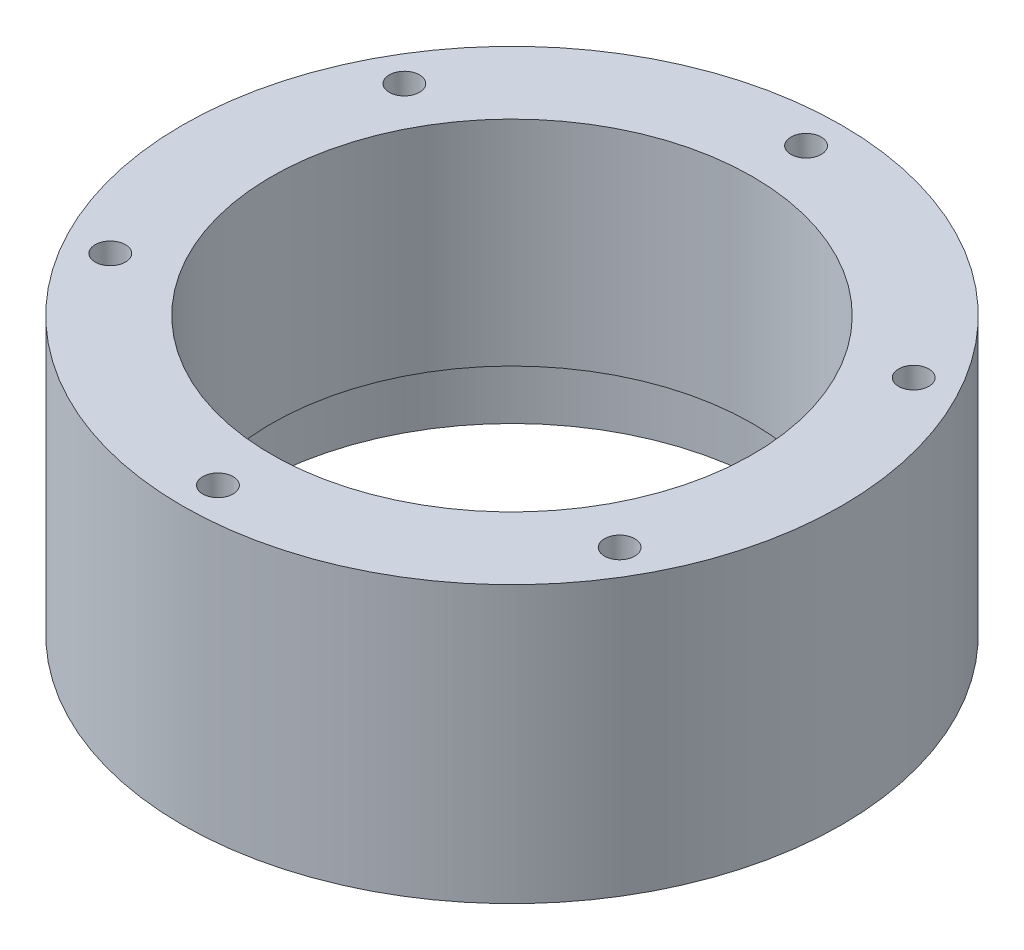
ISO-10303-21;
HEADER;
FILE_DESCRIPTION(('STEP AP214'),'2;1');
FILE_NAME('part.step','',(''),(''),'','','');
FILE_SCHEMA(('AUTOMOTIVE_DESIGN { 1 0 10303 214 1 1 1 1 }'));
ENDSEC;
DATA;
#1=APPLICATION_CONTEXT('core data for automotive mechanical design processes');
#2=APPLICATION_PROTOCOL_DEFINITION('international standard','automotive_design',2000,#1);
#3=PRODUCT_CONTEXT('',#1,'mechanical');
#4=PRODUCT('Part','Part','',(#3));
#5=PRODUCT_RELATED_PRODUCT_CATEGORY('part','',(#4));
#6=PRODUCT_DEFINITION_FORMATION('','',#4);
#7=PRODUCT_DEFINITION_CONTEXT('part definition',#1,'design');
#8=PRODUCT_DEFINITION('design','',#6,#7);
#9=PRODUCT_DEFINITION_SHAPE('','',#8);
#10=(LENGTH_UNIT() NAMED_UNIT(*) SI_UNIT(.MILLI.,.METRE.));
#11=(NAMED_UNIT(*) PLANE_ANGLE_UNIT() SI_UNIT($,.RADIAN.));
#12=(NAMED_UNIT(*) SI_UNIT($,.STERADIAN.) SOLID_ANGLE_UNIT());
#13=UNCERTAINTY_MEASURE_WITH_UNIT(LENGTH_MEASURE(1.E-05),#10,'distance_accuracy_value','');
#14=(GEOMETRIC_REPRESENTATION_CONTEXT(3) GLOBAL_UNCERTAINTY_ASSIGNED_CONTEXT((#13)) GLOBAL_UNIT_ASSIGNED_CONTEXT((#10,
#11,#12)) REPRESENTATION_CONTEXT('',''));
#15=CARTESIAN_POINT('',(0.,0.,0.));
#16=DIRECTION('',(0.,0.,1.));
#17=DIRECTION('',(1.,0.,0.));
#18=AXIS2_PLACEMENT_3D('',#15,#16,#17);
#19=CARTESIAN_POINT('',(0.,0.,0.));
#20=DIRECTION('',(0.,-1.,0.));
#21=DIRECTION('',(0.,0.,-1.));
#22=AXIS2_PLACEMENT_3D('',#19,#20,#21);
#23=CYLINDRICAL_SURFACE('',#22,29.);
#24=CARTESIAN_POINT('',(0.,0.,0.));
#25=DIRECTION('',(0.,-1.,0.));
#26=DIRECTION('',(0.,0.,-1.));
#27=AXIS2_PLACEMENT_3D('',#24,#25,#26);
#28=CIRCLE('',#27,29.);
#29=CARTESIAN_POINT('',(0.,0.,-29.));
#30=VERTEX_POINT('',#29);
#31=EDGE_CURVE('E10',#30,#30,#28,.T.);
#32=ORIENTED_EDGE('',*,*,#31,.T.);
#33=EDGE_LOOP('',(#32));
#34=FACE_BOUND('',#33,.T.);
#35=CARTESIAN_POINT('',(0.,7.,0.));
#36=DIRECTION('',(0.,-1.,0.));
#37=DIRECTION('',(0.,0.,-1.));
#38=AXIS2_PLACEMENT_3D('',#35,#36,#37);
#39=CIRCLE('',#38,29.);
#40=CARTESIAN_POINT('',(0.,7.,-29.));
#41=VERTEX_POINT('',#40);
#42=EDGE_CURVE('E70',#41,#41,#39,.T.);
#43=ORIENTED_EDGE('',*,*,#42,.F.);
#44=EDGE_LOOP('',(#43));
#45=FACE_BOUND('',#44,.T.);
#46=ADVANCED_FACE('F43',(#34,#45),#23,.F.);
#47=CARTESIAN_POINT('',(29.,0.,0.));
#48=DIRECTION('',(0.,-1.,0.));
#49=DIRECTION('',(0.,0.,-1.));
#50=AXIS2_PLACEMENT_3D('',#47,#48,#49);
#51=PLANE('',#50);
#52=CARTESIAN_POINT('',(0.,0.,33.));
#53=DIRECTION('',(0.,-1.,0.));
#54=DIRECTION('',(0.,0.,-1.));
#55=AXIS2_PLACEMENT_3D('',#52,#53,#54);
#56=CIRCLE('',#55,3.25);
#57=CARTESIAN_POINT('',(0.,0.,29.75));
#58=VERTEX_POINT('',#57);
#59=EDGE_CURVE('E166',#58,#58,#56,.T.);
#60=ORIENTED_EDGE('',*,*,#59,.F.);
#61=EDGE_LOOP('',(#60));
#62=FACE_BOUND('',#61,.T.);
#63=CARTESIAN_POINT('',(28.5788383248865,0.,16.4999999999999));
#64=DIRECTION('',(0.,-1.,0.));
#65=DIRECTION('',(0.,0.,-1.));
#66=AXIS2_PLACEMENT_3D('',#63,#64,#65);
#67=CIRCLE('',#66,3.25);
#68=CARTESIAN_POINT('',(28.5788383248865,0.,13.2499999999999));
#69=VERTEX_POINT('',#68);
#70=EDGE_CURVE('E150',#69,#69,#67,.T.);
#71=ORIENTED_EDGE('',*,*,#70,.F.);
#72=EDGE_LOOP('',(#71));
#73=FACE_BOUND('',#72,.T.);
#74=CARTESIAN_POINT('',(28.5788383248864,0.,-16.5000000000001));
#75=DIRECTION('',(0.,-1.,0.));
#76=DIRECTION('',(0.,0.,-1.));
#77=AXIS2_PLACEMENT_3D('',#74,#75,#76);
#78=CIRCLE('',#77,3.25);
#79=CARTESIAN_POINT('',(28.5788383248864,0.,-19.7500000000001));
#80=VERTEX_POINT('',#79);
#81=EDGE_CURVE('E134',#80,#80,#78,.T.);
#82=ORIENTED_EDGE('',*,*,#81,.F.);
#83=EDGE_LOOP('',(#82));
#84=FACE_BOUND('',#83,.T.);
#85=CARTESIAN_POINT('',(-2.30437768363647E-13,0.,-33.));
#86=DIRECTION('',(0.,-1.,0.));
#87=DIRECTION('',(0.,0.,-1.));
#88=AXIS2_PLACEMENT_3D('',#85,#86,#87);
#89=CIRCLE('',#88,3.25);
#90=CARTESIAN_POINT('',(-2.30437768363647E-13,0.,-36.25));
#91=VERTEX_POINT('',#90);
#92=EDGE_CURVE('E118',#91,#91,#89,.T.);
#93=ORIENTED_EDGE('',*,*,#92,.F.);
#94=EDGE_LOOP('',(#93));
#95=FACE_BOUND('',#94,.T.);
#96=CARTESIAN_POINT('',(-28.5788383248866,0.,-16.4999999999997));
#97=DIRECTION('',(0.,-1.,0.));
#98=DIRECTION('',(0.,0.,-1.));
#99=AXIS2_PLACEMENT_3D('',#96,#97,#98);
#100=CIRCLE('',#99,3.25);
#101=CARTESIAN_POINT('',(-28.5788383248866,0.,-19.7499999999997));
#102=VERTEX_POINT('',#101);
#103=EDGE_CURVE('E102',#102,#102,#100,.T.);
#104=ORIENTED_EDGE('',*,*,#103,.F.);
#105=EDGE_LOOP('',(#104));
#106=FACE_BOUND('',#105,.T.);
#107=CARTESIAN_POINT('',(-28.5788383248863,0.,16.5000000000003));
#108=DIRECTION('',(0.,-1.,0.));
#109=DIRECTION('',(0.,0.,-1.));
#110=AXIS2_PLACEMENT_3D('',#107,#108,#109);
#111=CIRCLE('',#110,3.25);
#112=CARTESIAN_POINT('',(-28.5788383248863,0.,13.2500000000003));
#113=VERTEX_POINT('',#112);
#114=EDGE_CURVE('E86',#113,#113,#111,.T.);
#115=ORIENTED_EDGE('',*,*,#114,.F.);
#116=EDGE_LOOP('',(#115));
#117=FACE_BOUND('',#116,.T.);
#118=CARTESIAN_POINT('',(0.,0.,0.));
#119=DIRECTION('',(0.,-1.,0.));
#120=DIRECTION('',(0.,0.,-1.));
#121=AXIS2_PLACEMENT_3D('',#118,#119,#120);
#122=CIRCLE('',#121,37.);
#123=CARTESIAN_POINT('',(0.,0.,-37.));
#124=VERTEX_POINT('',#123);
#125=EDGE_CURVE('E50',#124,#124,#122,.T.);
#126=ORIENTED_EDGE('',*,*,#125,.T.);
#127=EDGE_LOOP('',(#126));
#128=FACE_BOUND('',#127,.T.);
#129=ORIENTED_EDGE('',*,*,#31,.F.);
#130=EDGE_LOOP('',(#129));
#131=FACE_BOUND('',#130,.T.);
#132=ADVANCED_FACE('F173',(#62,#73,#84,#95,#106,#117,#128,#131),#51,.T.);
#133=CARTESIAN_POINT('',(0.,0.,0.));
#134=DIRECTION('',(0.,-1.,0.));
#135=DIRECTION('',(0.,0.,-1.));
#136=AXIS2_PLACEMENT_3D('',#133,#134,#135);
#137=CYLINDRICAL_SURFACE('',#136,37.);
#138=CARTESIAN_POINT('',(0.,31.,0.));
#139=DIRECTION('',(0.,-1.,0.));
#140=DIRECTION('',(0.,0.,-1.));
#141=AXIS2_PLACEMENT_3D('',#138,#139,#140);
#142=CIRCLE('',#141,37.);
#143=CARTESIAN_POINT('',(0.,31.,-37.));
#144=VERTEX_POINT('',#143);
#145=EDGE_CURVE('E55',#144,#144,#142,.T.);
#146=ORIENTED_EDGE('',*,*,#145,.T.);
#147=EDGE_LOOP('',(#146));
#148=FACE_BOUND('',#147,.T.);
#149=ORIENTED_EDGE('',*,*,#125,.F.);
#150=EDGE_LOOP('',(#149));
#151=FACE_BOUND('',#150,.T.);
#152=ADVANCED_FACE('F176',(#148,#151),#137,.T.);
#153=CARTESIAN_POINT('',(37.,31.,0.));
#154=DIRECTION('',(0.,1.,0.));
#155=DIRECTION('',(0.,0.,1.));
#156=AXIS2_PLACEMENT_3D('',#153,#154,#155);
#157=PLANE('',#156);
#158=CARTESIAN_POINT('',(0.,31.,33.));
#159=DIRECTION('',(0.,-1.,0.));
#160=DIRECTION('',(0.,0.,-1.));
#161=AXIS2_PLACEMENT_3D('',#158,#159,#160);
#162=CIRCLE('',#161,1.69999999999999);
#163=CARTESIAN_POINT('',(0.,31.,31.3));
#164=VERTEX_POINT('',#163);
#165=EDGE_CURVE('E154',#164,#164,#162,.T.);
#166=ORIENTED_EDGE('',*,*,#165,.T.);
#167=EDGE_LOOP('',(#166));
#168=FACE_BOUND('',#167,.T.);
#169=CARTESIAN_POINT('',(28.5788383248865,31.,16.4999999999999));
#170=DIRECTION('',(0.,-1.,0.));
#171=DIRECTION('',(0.,0.,-1.));
#172=AXIS2_PLACEMENT_3D('',#169,#170,#171);
#173=CIRCLE('',#172,1.69999999999999);
#174=CARTESIAN_POINT('',(28.5788383248865,31.,14.7999999999999));
#175=VERTEX_POINT('',#174);
#176=EDGE_CURVE('E138',#175,#175,#173,.T.);
#177=ORIENTED_EDGE('',*,*,#176,.T.);
#178=EDGE_LOOP('',(#177));
#179=FACE_BOUND('',#178,.T.);
#180=CARTESIAN_POINT('',(28.5788383248864,31.,-16.5000000000001));
#181=DIRECTION('',(0.,-1.,0.));
#182=DIRECTION('',(0.,0.,-1.));
#183=AXIS2_PLACEMENT_3D('',#180,#181,#182);
#184=CIRCLE('',#183,1.69999999999999);
#185=CARTESIAN_POINT('',(28.5788383248864,31.,-18.2000000000001));
#186=VERTEX_POINT('',#185);
#187=EDGE_CURVE('E122',#186,#186,#184,.T.);
#188=ORIENTED_EDGE('',*,*,#187,.T.);
#189=EDGE_LOOP('',(#188));
#190=FACE_BOUND('',#189,.T.);
#191=CARTESIAN_POINT('',(-2.30437768363647E-13,31.,-33.));
#192=DIRECTION('',(0.,-1.,0.));
#193=DIRECTION('',(0.,0.,-1.));
#194=AXIS2_PLACEMENT_3D('',#191,#192,#193);
#195=CIRCLE('',#194,1.69999999999999);
#196=CARTESIAN_POINT('',(-2.30437768363647E-13,31.,-34.7));
#197=VERTEX_POINT('',#196);
#198=EDGE_CURVE('E106',#197,#197,#195,.T.);
#199=ORIENTED_EDGE('',*,*,#198,.T.);
#200=EDGE_LOOP('',(#199));
#201=FACE_BOUND('',#200,.T.);
#202=CARTESIAN_POINT('',(-28.5788383248866,31.,-16.4999999999997));
#203=DIRECTION('',(0.,-1.,0.));
#204=DIRECTION('',(0.,0.,-1.));
#205=AXIS2_PLACEMENT_3D('',#202,#203,#204);
#206=CIRCLE('',#205,1.69999999999999);
#207=CARTESIAN_POINT('',(-28.5788383248866,31.,-18.1999999999997));
#208=VERTEX_POINT('',#207);
#209=EDGE_CURVE('E90',#208,#208,#206,.T.);
#210=ORIENTED_EDGE('',*,*,#209,.T.);
#211=EDGE_LOOP('',(#210));
#212=FACE_BOUND('',#211,.T.);
#213=CARTESIAN_POINT('',(-28.5788383248863,31.,16.5000000000003));
#214=DIRECTION('',(0.,-1.,0.));
#215=DIRECTION('',(0.,0.,-1.));
#216=AXIS2_PLACEMENT_3D('',#213,#214,#215);
#217=CIRCLE('',#216,1.69999999999999);
#218=CARTESIAN_POINT('',(-28.5788383248863,31.,14.8000000000003));
#219=VERTEX_POINT('',#218);
#220=EDGE_CURVE('E74',#219,#219,#217,.T.);
#221=ORIENTED_EDGE('',*,*,#220,.T.);
#222=EDGE_LOOP('',(#221));
#223=FACE_BOUND('',#222,.T.);
#224=CARTESIAN_POINT('',(0.,31.,0.));
#225=DIRECTION('',(0.,-1.,0.));
#226=DIRECTION('',(0.,0.,-1.));
#227=AXIS2_PLACEMENT_3D('',#224,#225,#226);
#228=CIRCLE('',#227,27.);
#229=CARTESIAN_POINT('',(0.,31.,-27.));
#230=VERTEX_POINT('',#229);
#231=EDGE_CURVE('E60',#230,#230,#228,.T.);
#232=ORIENTED_EDGE('',*,*,#231,.T.);
#233=EDGE_LOOP('',(#232));
#234=FACE_BOUND('',#233,.T.);
#235=ORIENTED_EDGE('',*,*,#145,.F.);
#236=EDGE_LOOP('',(#235));
#237=FACE_BOUND('',#236,.T.);
#238=ADVANCED_FACE('F221',(#168,#179,#190,#201,#212,#223,#234,#237),#157,.T.);
#239=CARTESIAN_POINT('',(0.,0.,0.));
#240=DIRECTION('',(0.,-1.,0.));
#241=DIRECTION('',(0.,0.,-1.));
#242=AXIS2_PLACEMENT_3D('',#239,#240,#241);
#243=CYLINDRICAL_SURFACE('',#242,27.);
#244=CARTESIAN_POINT('',(0.,7.,0.));
#245=DIRECTION('',(0.,-1.,0.));
#246=DIRECTION('',(0.,0.,-1.));
#247=AXIS2_PLACEMENT_3D('',#244,#245,#246);
#248=CIRCLE('',#247,27.);
#249=CARTESIAN_POINT('',(0.,7.,-27.));
#250=VERTEX_POINT('',#249);
#251=EDGE_CURVE('E66',#250,#250,#248,.T.);
#252=ORIENTED_EDGE('',*,*,#251,.T.);
#253=EDGE_LOOP('',(#252));
#254=FACE_BOUND('',#253,.T.);
#255=ORIENTED_EDGE('',*,*,#231,.F.);
#256=EDGE_LOOP('',(#255));
#257=FACE_BOUND('',#256,.T.);
#258=ADVANCED_FACE('F215',(#254,#257),#243,.F.);
#259=CARTESIAN_POINT('',(27.,7.,0.));
#260=DIRECTION('',(0.,-1.,0.));
#261=DIRECTION('',(0.,0.,-1.));
#262=AXIS2_PLACEMENT_3D('',#259,#260,#261);
#263=PLANE('',#262);
#264=ORIENTED_EDGE('',*,*,#42,.T.);
#265=EDGE_LOOP('',(#264));
#266=FACE_BOUND('',#265,.T.);
#267=ORIENTED_EDGE('',*,*,#251,.F.);
#268=EDGE_LOOP('',(#267));
#269=FACE_BOUND('',#268,.T.);
#270=ADVANCED_FACE('F212',(#266,#269),#263,.T.);
#271=CARTESIAN_POINT('',(-28.5788383248863,0.,16.5000000000003));
#272=DIRECTION('',(0.,-1.,0.));
#273=DIRECTION('',(0.,0.,-1.));
#274=AXIS2_PLACEMENT_3D('',#271,#272,#273);
#275=CYLINDRICAL_SURFACE('',#274,1.69999999999999);
#276=ORIENTED_EDGE('',*,*,#220,.F.);
#277=EDGE_LOOP('',(#276));
#278=FACE_BOUND('',#277,.T.);
#279=CARTESIAN_POINT('',(-28.5788383248863,3.4,16.5000000000003));
#280=DIRECTION('',(0.,-1.,0.));
#281=DIRECTION('',(0.,0.,-1.));
#282=AXIS2_PLACEMENT_3D('',#279,#280,#281);
#283=CIRCLE('',#282,1.7);
#284=CARTESIAN_POINT('',(-28.5788383248863,3.4,14.8000000000003));
#285=VERTEX_POINT('',#284);
#286=EDGE_CURVE('E78',#285,#285,#283,.T.);
#287=ORIENTED_EDGE('',*,*,#286,.T.);
#288=EDGE_LOOP('',(#287));
#289=FACE_BOUND('',#288,.T.);
#290=ADVANCED_FACE('F201',(#278,#289),#275,.F.);
#291=CARTESIAN_POINT('',(-26.8788383248863,3.4,16.5000000000003));
#292=DIRECTION('',(0.,1.,0.));
#293=DIRECTION('',(0.,0.,1.));
#294=AXIS2_PLACEMENT_3D('',#291,#292,#293);
#295=PLANE('',#294);
#296=ORIENTED_EDGE('',*,*,#286,.F.);
#297=EDGE_LOOP('',(#296));
#298=FACE_BOUND('',#297,.T.);
#299=CARTESIAN_POINT('',(-28.5788383248863,3.4,16.5000000000003));
#300=DIRECTION('',(0.,-1.,0.));
#301=DIRECTION('',(0.,0.,-1.));
#302=AXIS2_PLACEMENT_3D('',#299,#300,#301);
#303=CIRCLE('',#302,3.25);
#304=CARTESIAN_POINT('',(-28.5788383248863,3.4,13.2500000000003));
#305=VERTEX_POINT('',#304);
#306=EDGE_CURVE('E82',#305,#305,#303,.T.);
#307=ORIENTED_EDGE('',*,*,#306,.T.);
#308=EDGE_LOOP('',(#307));
#309=FACE_BOUND('',#308,.T.);
#310=ADVANCED_FACE('F191',(#298,#309),#295,.F.);
#311=CARTESIAN_POINT('',(-28.5788383248863,0.,16.5000000000003));
#312=DIRECTION('',(0.,-1.,0.));
#313=DIRECTION('',(0.,0.,-1.));
#314=AXIS2_PLACEMENT_3D('',#311,#312,#313);
#315=CYLINDRICAL_SURFACE('',#314,3.25);
#316=ORIENTED_EDGE('',*,*,#306,.F.);
#317=EDGE_LOOP('',(#316));
#318=FACE_BOUND('',#317,.T.);
#319=ORIENTED_EDGE('',*,*,#114,.T.);
#320=EDGE_LOOP('',(#319));
#321=FACE_BOUND('',#320,.T.);
#322=ADVANCED_FACE('F188',(#318,#321),#315,.F.);
#323=CARTESIAN_POINT('',(-28.5788383248866,0.,-16.4999999999997));
#324=DIRECTION('',(0.,-1.,0.));
#325=DIRECTION('',(0.,0.,-1.));
#326=AXIS2_PLACEMENT_3D('',#323,#324,#325);
#327=CYLINDRICAL_SURFACE('',#326,1.69999999999999);
#328=ORIENTED_EDGE('',*,*,#209,.F.);
#329=EDGE_LOOP('',(#328));
#330=FACE_BOUND('',#329,.T.);
#331=CARTESIAN_POINT('',(-28.5788383248866,3.4,-16.4999999999997));
#332=DIRECTION('',(0.,-1.,0.));
#333=DIRECTION('',(0.,0.,-1.));
#334=AXIS2_PLACEMENT_3D('',#331,#332,#333);
#335=CIRCLE('',#334,1.7);
#336=CARTESIAN_POINT('',(-28.5788383248866,3.4,-18.1999999999997));
#337=VERTEX_POINT('',#336);
#338=EDGE_CURVE('E94',#337,#337,#335,.T.);
#339=ORIENTED_EDGE('',*,*,#338,.T.);
#340=EDGE_LOOP('',(#339));
#341=FACE_BOUND('',#340,.T.);
#342=ADVANCED_FACE('F190',(#330,#341),#327,.F.);
#343=CARTESIAN_POINT('',(-26.8788383248866,3.4,-16.4999999999997));
#344=DIRECTION('',(0.,1.,0.));
#345=DIRECTION('',(0.,0.,1.));
#346=AXIS2_PLACEMENT_3D('',#343,#344,#345);
#347=PLANE('',#346);
#348=ORIENTED_EDGE('',*,*,#338,.F.);
#349=EDGE_LOOP('',(#348));
#350=FACE_BOUND('',#349,.T.);
#351=CARTESIAN_POINT('',(-28.5788383248866,3.4,-16.4999999999997));
#352=DIRECTION('',(0.,-1.,0.));
#353=DIRECTION('',(0.,0.,-1.));
#354=AXIS2_PLACEMENT_3D('',#351,#352,#353);
#355=CIRCLE('',#354,3.25);
#356=CARTESIAN_POINT('',(-28.5788383248866,3.4,-19.7499999999997));
#357=VERTEX_POINT('',#356);
#358=EDGE_CURVE('E98',#357,#357,#355,.T.);
#359=ORIENTED_EDGE('',*,*,#358,.T.);
#360=EDGE_LOOP('',(#359));
#361=FACE_BOUND('',#360,.T.);
#362=ADVANCED_FACE('F198',(#350,#361),#347,.F.);
#363=CARTESIAN_POINT('',(-28.5788383248866,0.,-16.4999999999997));
#364=DIRECTION('',(0.,-1.,0.));
#365=DIRECTION('',(0.,0.,-1.));
#366=AXIS2_PLACEMENT_3D('',#363,#364,#365);
#367=CYLINDRICAL_SURFACE('',#366,3.25);
#368=ORIENTED_EDGE('',*,*,#358,.F.);
#369=EDGE_LOOP('',(#368));
#370=FACE_BOUND('',#369,.T.);
#371=ORIENTED_EDGE('',*,*,#103,.T.);
#372=EDGE_LOOP('',(#371));
#373=FACE_BOUND('',#372,.T.);
#374=ADVANCED_FACE('F273',(#370,#373),#367,.F.);
#375=CARTESIAN_POINT('',(-2.30437768363647E-13,0.,-33.));
#376=DIRECTION('',(0.,-1.,0.));
#377=DIRECTION('',(0.,0.,-1.));
#378=AXIS2_PLACEMENT_3D('',#375,#376,#377);
#379=CYLINDRICAL_SURFACE('',#378,1.69999999999999);
#380=ORIENTED_EDGE('',*,*,#198,.F.);
#381=EDGE_LOOP('',(#380));
#382=FACE_BOUND('',#381,.T.);
#383=CARTESIAN_POINT('',(-2.30437768363647E-13,3.4,-33.));
#384=DIRECTION('',(0.,-1.,0.));
#385=DIRECTION('',(0.,0.,-1.));
#386=AXIS2_PLACEMENT_3D('',#383,#384,#385);
#387=CIRCLE('',#386,1.7);
#388=CARTESIAN_POINT('',(-2.30437768363647E-13,3.4,-34.7));
#389=VERTEX_POINT('',#388);
#390=EDGE_CURVE('E110',#389,#389,#387,.T.);
#391=ORIENTED_EDGE('',*,*,#390,.T.);
#392=EDGE_LOOP('',(#391));
#393=FACE_BOUND('',#392,.T.);
#394=ADVANCED_FACE('F283',(#382,#393),#379,.F.);
#395=CARTESIAN_POINT('',(1.69999999999977,3.4,-33.));
#396=DIRECTION('',(0.,1.,0.));
#397=DIRECTION('',(0.,0.,1.));
#398=AXIS2_PLACEMENT_3D('',#395,#396,#397);
#399=PLANE('',#398);
#400=ORIENTED_EDGE('',*,*,#390,.F.);
#401=EDGE_LOOP('',(#400));
#402=FACE_BOUND('',#401,.T.);
#403=CARTESIAN_POINT('',(-2.30437768363647E-13,3.4,-33.));
#404=DIRECTION('',(0.,-1.,0.));
#405=DIRECTION('',(0.,0.,-1.));
#406=AXIS2_PLACEMENT_3D('',#403,#404,#405);
#407=CIRCLE('',#406,3.25);
#408=CARTESIAN_POINT('',(-2.30437768363647E-13,3.4,-36.25));
#409=VERTEX_POINT('',#408);
#410=EDGE_CURVE('E114',#409,#409,#407,.T.);
#411=ORIENTED_EDGE('',*,*,#410,.T.);
#412=EDGE_LOOP('',(#411));
#413=FACE_BOUND('',#412,.T.);
#414=ADVANCED_FACE('F293',(#402,#413),#399,.F.);
#415=CARTESIAN_POINT('',(-2.30437768363647E-13,0.,-33.));
#416=DIRECTION('',(0.,-1.,0.));
#417=DIRECTION('',(0.,0.,-1.));
#418=AXIS2_PLACEMENT_3D('',#415,#416,#417);
#419=CYLINDRICAL_SURFACE('',#418,3.25);
#420=ORIENTED_EDGE('',*,*,#410,.F.);
#421=EDGE_LOOP('',(#420));
#422=FACE_BOUND('',#421,.T.);
#423=ORIENTED_EDGE('',*,*,#92,.T.);
#424=EDGE_LOOP('',(#423));
#425=FACE_BOUND('',#424,.T.);
#426=ADVANCED_FACE('F303',(#422,#425),#419,.F.);
#427=CARTESIAN_POINT('',(28.5788383248864,0.,-16.5000000000001));
#428=DIRECTION('',(0.,-1.,0.));
#429=DIRECTION('',(0.,0.,-1.));
#430=AXIS2_PLACEMENT_3D('',#427,#428,#429);
#431=CYLINDRICAL_SURFACE('',#430,1.69999999999999);
#432=ORIENTED_EDGE('',*,*,#187,.F.);
#433=EDGE_LOOP('',(#432));
#434=FACE_BOUND('',#433,.T.);
#435=CARTESIAN_POINT('',(28.5788383248864,3.4,-16.5000000000001));
#436=DIRECTION('',(0.,-1.,0.));
#437=DIRECTION('',(0.,0.,-1.));
#438=AXIS2_PLACEMENT_3D('',#435,#436,#437);
#439=CIRCLE('',#438,1.7);
#440=CARTESIAN_POINT('',(28.5788383248864,3.4,-18.2000000000001));
#441=VERTEX_POINT('',#440);
#442=EDGE_CURVE('E126',#441,#441,#439,.T.);
#443=ORIENTED_EDGE('',*,*,#442,.T.);
#444=EDGE_LOOP('',(#443));
#445=FACE_BOUND('',#444,.T.);
#446=ADVANCED_FACE('F313',(#434,#445),#431,.F.);
#447=CARTESIAN_POINT('',(30.2788383248864,3.4,-16.5000000000001));
#448=DIRECTION('',(0.,1.,0.));
#449=DIRECTION('',(0.,0.,1.));
#450=AXIS2_PLACEMENT_3D('',#447,#448,#449);
#451=PLANE('',#450);
#452=ORIENTED_EDGE('',*,*,#442,.F.);
#453=EDGE_LOOP('',(#452));
#454=FACE_BOUND('',#453,.T.);
#455=CARTESIAN_POINT('',(28.5788383248864,3.4,-16.5000000000001));
#456=DIRECTION('',(0.,-1.,0.));
#457=DIRECTION('',(0.,0.,-1.));
#458=AXIS2_PLACEMENT_3D('',#455,#456,#457);
#459=CIRCLE('',#458,3.25);
#460=CARTESIAN_POINT('',(28.5788383248864,3.4,-19.7500000000001));
#461=VERTEX_POINT('',#460);
#462=EDGE_CURVE('E130',#461,#461,#459,.T.);
#463=ORIENTED_EDGE('',*,*,#462,.T.);
#464=EDGE_LOOP('',(#463));
#465=FACE_BOUND('',#464,.T.);
#466=ADVANCED_FACE('F323',(#454,#465),#451,.F.);
#467=CARTESIAN_POINT('',(28.5788383248864,0.,-16.5000000000001));
#468=DIRECTION('',(0.,-1.,0.));
#469=DIRECTION('',(0.,0.,-1.));
#470=AXIS2_PLACEMENT_3D('',#467,#468,#469);
#471=CYLINDRICAL_SURFACE('',#470,3.25);
#472=ORIENTED_EDGE('',*,*,#462,.F.);
#473=EDGE_LOOP('',(#472));
#474=FACE_BOUND('',#473,.T.);
#475=ORIENTED_EDGE('',*,*,#81,.T.);
#476=EDGE_LOOP('',(#475));
#477=FACE_BOUND('',#476,.T.);
#478=ADVANCED_FACE('F333',(#474,#477),#471,.F.);
#479=CARTESIAN_POINT('',(28.5788383248865,0.,16.4999999999999));
#480=DIRECTION('',(0.,-1.,0.));
#481=DIRECTION('',(0.,0.,-1.));
#482=AXIS2_PLACEMENT_3D('',#479,#480,#481);
#483=CYLINDRICAL_SURFACE('',#482,1.69999999999999);
#484=ORIENTED_EDGE('',*,*,#176,.F.);
#485=EDGE_LOOP('',(#484));
#486=FACE_BOUND('',#485,.T.);
#487=CARTESIAN_POINT('',(28.5788383248865,3.4,16.4999999999999));
#488=DIRECTION('',(0.,-1.,0.));
#489=DIRECTION('',(0.,0.,-1.));
#490=AXIS2_PLACEMENT_3D('',#487,#488,#489);
#491=CIRCLE('',#490,1.7);
#492=CARTESIAN_POINT('',(28.5788383248865,3.4,14.7999999999999));
#493=VERTEX_POINT('',#492);
#494=EDGE_CURVE('E142',#493,#493,#491,.T.);
#495=ORIENTED_EDGE('',*,*,#494,.T.);
#496=EDGE_LOOP('',(#495));
#497=FACE_BOUND('',#496,.T.);
#498=ADVANCED_FACE('F343',(#486,#497),#483,.F.);
#499=CARTESIAN_POINT('',(30.2788383248865,3.4,16.4999999999999));
#500=DIRECTION('',(0.,1.,0.));
#501=DIRECTION('',(0.,0.,1.));
#502=AXIS2_PLACEMENT_3D('',#499,#500,#501);
#503=PLANE('',#502);
#504=ORIENTED_EDGE('',*,*,#494,.F.);
#505=EDGE_LOOP('',(#504));
#506=FACE_BOUND('',#505,.T.);
#507=CARTESIAN_POINT('',(28.5788383248865,3.4,16.4999999999999));
#508=DIRECTION('',(0.,-1.,0.));
#509=DIRECTION('',(0.,0.,-1.));
#510=AXIS2_PLACEMENT_3D('',#507,#508,#509);
#511=CIRCLE('',#510,3.25);
#512=CARTESIAN_POINT('',(28.5788383248865,3.4,13.2499999999999));
#513=VERTEX_POINT('',#512);
#514=EDGE_CURVE('E146',#513,#513,#511,.T.);
#515=ORIENTED_EDGE('',*,*,#514,.T.);
#516=EDGE_LOOP('',(#515));
#517=FACE_BOUND('',#516,.T.);
#518=ADVANCED_FACE('F353',(#506,#517),#503,.F.);
#519=CARTESIAN_POINT('',(28.5788383248865,0.,16.4999999999999));
#520=DIRECTION('',(0.,-1.,0.));
#521=DIRECTION('',(0.,0.,-1.));
#522=AXIS2_PLACEMENT_3D('',#519,#520,#521);
#523=CYLINDRICAL_SURFACE('',#522,3.25);
#524=ORIENTED_EDGE('',*,*,#514,.F.);
#525=EDGE_LOOP('',(#524));
#526=FACE_BOUND('',#525,.T.);
#527=ORIENTED_EDGE('',*,*,#70,.T.);
#528=EDGE_LOOP('',(#527));
#529=FACE_BOUND('',#528,.T.);
#530=ADVANCED_FACE('F363',(#526,#529),#523,.F.);
#531=CARTESIAN_POINT('',(0.,0.,33.));
#532=DIRECTION('',(0.,-1.,0.));
#533=DIRECTION('',(0.,0.,-1.));
#534=AXIS2_PLACEMENT_3D('',#531,#532,#533);
#535=CYLINDRICAL_SURFACE('',#534,1.69999999999999);
#536=ORIENTED_EDGE('',*,*,#165,.F.);
#537=EDGE_LOOP('',(#536));
#538=FACE_BOUND('',#537,.T.);
#539=CARTESIAN_POINT('',(0.,3.4,33.));
#540=DIRECTION('',(0.,-1.,0.));
#541=DIRECTION('',(0.,0.,-1.));
#542=AXIS2_PLACEMENT_3D('',#539,#540,#541);
#543=CIRCLE('',#542,1.7);
#544=CARTESIAN_POINT('',(0.,3.4,31.3));
#545=VERTEX_POINT('',#544);
#546=EDGE_CURVE('E158',#545,#545,#543,.T.);
#547=ORIENTED_EDGE('',*,*,#546,.T.);
#548=EDGE_LOOP('',(#547));
#549=FACE_BOUND('',#548,.T.);
#550=ADVANCED_FACE('F373',(#538,#549),#535,.F.);
#551=CARTESIAN_POINT('',(1.7,3.4,33.));
#552=DIRECTION('',(0.,1.,0.));
#553=DIRECTION('',(0.,0.,1.));
#554=AXIS2_PLACEMENT_3D('',#551,#552,#553);
#555=PLANE('',#554);
#556=ORIENTED_EDGE('',*,*,#546,.F.);
#557=EDGE_LOOP('',(#556));
#558=FACE_BOUND('',#557,.T.);
#559=CARTESIAN_POINT('',(0.,3.4,33.));
#560=DIRECTION('',(0.,-1.,0.));
#561=DIRECTION('',(0.,0.,-1.));
#562=AXIS2_PLACEMENT_3D('',#559,#560,#561);
#563=CIRCLE('',#562,3.25);
#564=CARTESIAN_POINT('',(0.,3.4,29.75));
#565=VERTEX_POINT('',#564);
#566=EDGE_CURVE('E162',#565,#565,#563,.T.);
#567=ORIENTED_EDGE('',*,*,#566,.T.);
#568=EDGE_LOOP('',(#567));
#569=FACE_BOUND('',#568,.T.);
#570=ADVANCED_FACE('F383',(#558,#569),#555,.F.);
#571=CARTESIAN_POINT('',(0.,0.,33.));
#572=DIRECTION('',(0.,-1.,0.));
#573=DIRECTION('',(0.,0.,-1.));
#574=AXIS2_PLACEMENT_3D('',#571,#572,#573);
#575=CYLINDRICAL_SURFACE('',#574,3.25);
#576=ORIENTED_EDGE('',*,*,#566,.F.);
#577=EDGE_LOOP('',(#576));
#578=FACE_BOUND('',#577,.T.);
#579=ORIENTED_EDGE('',*,*,#59,.T.);
#580=EDGE_LOOP('',(#579));
#581=FACE_BOUND('',#580,.T.);
#582=ADVANCED_FACE('F171',(#578,#581),#575,.F.);
#583=CLOSED_SHELL('',(#46,#132,#152,#238,#258,#270,#290,#310,#322,#342,#362,#374,#394,#414,#426,
#446,#466,#478,#498,#518,#530,#550,#570,#582));
#584=MANIFOLD_SOLID_BREP('B2',#583);
#585=ADVANCED_BREP_SHAPE_REPRESENTATION('',(#18,#584),#14);
#586=SHAPE_DEFINITION_REPRESENTATION(#9,#585);
ENDSEC;
END-ISO-10303-21;
